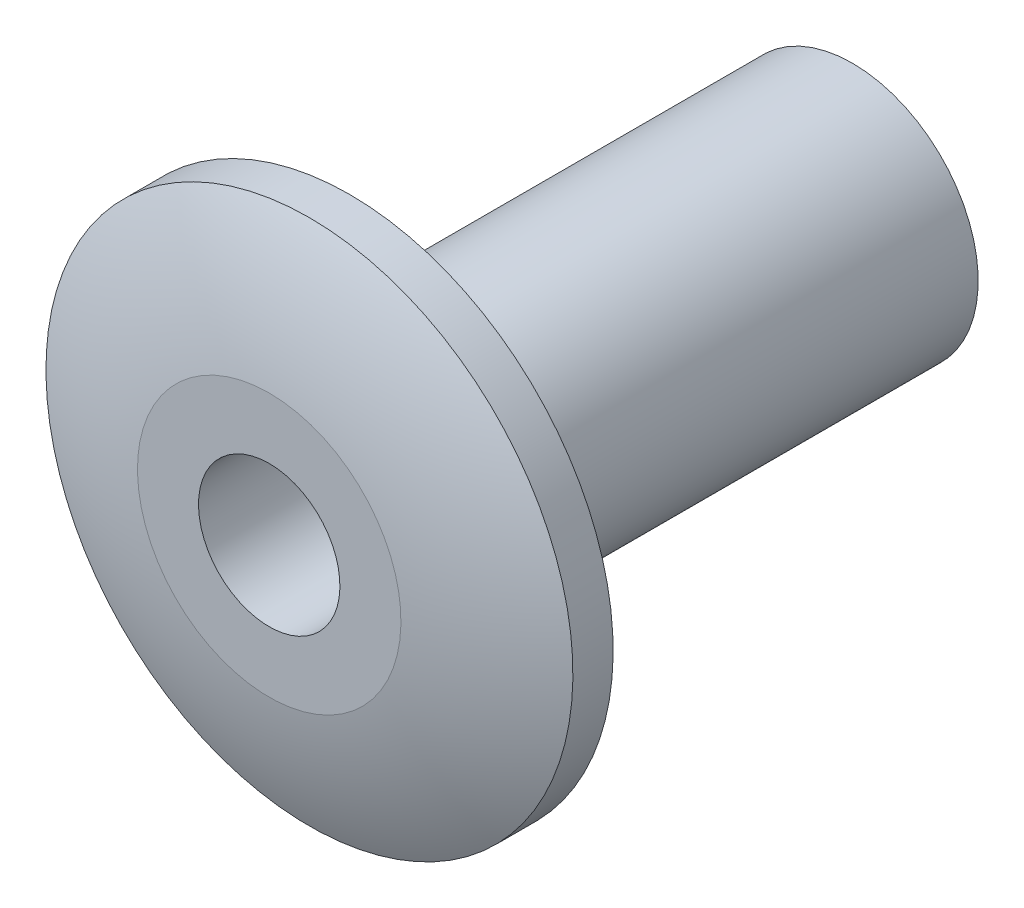
ISO-10303-21;
HEADER;
FILE_DESCRIPTION(('STEP AP214'),'2;1');
FILE_NAME('part.step','',(''),(''),'','','');
FILE_SCHEMA(('AUTOMOTIVE_DESIGN { 1 0 10303 214 1 1 1 1 }'));
ENDSEC;
DATA;
#1=APPLICATION_CONTEXT('core data for automotive mechanical design processes');
#2=APPLICATION_PROTOCOL_DEFINITION('international standard','automotive_design',2000,#1);
#3=PRODUCT_CONTEXT('',#1,'mechanical');
#4=PRODUCT('Part','Part','',(#3));
#5=PRODUCT_RELATED_PRODUCT_CATEGORY('part','',(#4));
#6=PRODUCT_DEFINITION_FORMATION('','',#4);
#7=PRODUCT_DEFINITION_CONTEXT('part definition',#1,'design');
#8=PRODUCT_DEFINITION('design','',#6,#7);
#9=PRODUCT_DEFINITION_SHAPE('','',#8);
#10=(LENGTH_UNIT() NAMED_UNIT(*) SI_UNIT(.MILLI.,.METRE.));
#11=(NAMED_UNIT(*) PLANE_ANGLE_UNIT() SI_UNIT($,.RADIAN.));
#12=(NAMED_UNIT(*) SI_UNIT($,.STERADIAN.) SOLID_ANGLE_UNIT());
#13=UNCERTAINTY_MEASURE_WITH_UNIT(LENGTH_MEASURE(1.E-05),#10,'distance_accuracy_value','');
#14=(GEOMETRIC_REPRESENTATION_CONTEXT(3) GLOBAL_UNCERTAINTY_ASSIGNED_CONTEXT((#13)) GLOBAL_UNIT_ASSIGNED_CONTEXT((#10,
#11,#12)) REPRESENTATION_CONTEXT('',''));
#15=CARTESIAN_POINT('',(0.,0.,0.));
#16=DIRECTION('',(0.,0.,1.));
#17=DIRECTION('',(1.,0.,0.));
#18=AXIS2_PLACEMENT_3D('',#15,#16,#17);
#19=CARTESIAN_POINT('',(0.,0.,-6.35));
#20=DIRECTION('',(0.,0.,-1.));
#21=DIRECTION('',(0.,1.,0.));
#22=AXIS2_PLACEMENT_3D('',#19,#20,#21);
#23=CYLINDRICAL_SURFACE('',#22,3.3274);
#24=CARTESIAN_POINT('',(0.,0.,0.507999999999998));
#25=DIRECTION('',(0.,0.,-1.));
#26=DIRECTION('',(0.,1.,0.));
#27=AXIS2_PLACEMENT_3D('',#24,#25,#26);
#28=CIRCLE('',#27,3.3274);
#29=CARTESIAN_POINT('',(0.,3.3274,0.507999999999998));
#30=VERTEX_POINT('',#29);
#31=EDGE_CURVE('E10',#30,#30,#28,.T.);
#32=ORIENTED_EDGE('',*,*,#31,.T.);
#33=EDGE_LOOP('',(#32));
#34=FACE_BOUND('',#33,.T.);
#35=CARTESIAN_POINT('',(0.,0.,0.));
#36=DIRECTION('',(0.,0.,-1.));
#37=DIRECTION('',(0.,1.,0.));
#38=AXIS2_PLACEMENT_3D('',#35,#36,#37);
#39=CIRCLE('',#38,3.3274);
#40=CARTESIAN_POINT('',(0.,3.3274,0.));
#41=VERTEX_POINT('',#40);
#42=EDGE_CURVE('E58',#41,#41,#39,.T.);
#43=ORIENTED_EDGE('',*,*,#42,.F.);
#44=EDGE_LOOP('',(#43));
#45=FACE_BOUND('',#44,.T.);
#46=ADVANCED_FACE('F33',(#34,#45),#23,.T.);
#47=CARTESIAN_POINT('',(0.,0.,-4.81139499999999));
#48=DIRECTION('',(0.,0.,-1.));
#49=DIRECTION('',(0.,1.,0.));
#50=AXIS2_PLACEMENT_3D('',#47,#48,#49);
#51=DEGENERATE_TOROIDAL_SURFACE('',#50,0.79375,5.89197297079042,.T.);
#52=CARTESIAN_POINT('',(0.,0.,1.016));
#53=DIRECTION('',(0.,0.,-1.));
#54=DIRECTION('',(0.,1.,0.));
#55=AXIS2_PLACEMENT_3D('',#52,#53,#54);
#56=CIRCLE('',#55,1.6637);
#57=CARTESIAN_POINT('',(0.,1.6637,1.016));
#58=VERTEX_POINT('',#57);
#59=EDGE_CURVE('E39',#58,#58,#56,.T.);
#60=ORIENTED_EDGE('',*,*,#59,.T.);
#61=EDGE_LOOP('',(#60));
#62=FACE_BOUND('',#61,.T.);
#63=ORIENTED_EDGE('',*,*,#31,.F.);
#64=EDGE_LOOP('',(#63));
#65=FACE_BOUND('',#64,.T.);
#66=ADVANCED_FACE('F66',(#62,#65),#51,.T.);
#67=CARTESIAN_POINT('',(0.,0.89296875,1.016));
#68=DIRECTION('',(0.,0.,1.));
#69=DIRECTION('',(0.,-1.,0.));
#70=AXIS2_PLACEMENT_3D('',#67,#68,#69);
#71=PLANE('',#70);
#72=CARTESIAN_POINT('',(0.,0.,1.016));
#73=DIRECTION('',(0.,0.,-1.));
#74=DIRECTION('',(0.,1.,0.));
#75=AXIS2_PLACEMENT_3D('',#72,#73,#74);
#76=CIRCLE('',#75,0.892968750000001);
#77=CARTESIAN_POINT('',(0.,0.89296875,1.016));
#78=VERTEX_POINT('',#77);
#79=EDGE_CURVE('E43',#78,#78,#76,.T.);
#80=ORIENTED_EDGE('',*,*,#79,.T.);
#81=EDGE_LOOP('',(#80));
#82=FACE_BOUND('',#81,.T.);
#83=ORIENTED_EDGE('',*,*,#59,.F.);
#84=EDGE_LOOP('',(#83));
#85=FACE_BOUND('',#84,.T.);
#86=ADVANCED_FACE('F70',(#82,#85),#71,.T.);
#87=CARTESIAN_POINT('',(0.,0.,-6.35));
#88=DIRECTION('',(0.,0.,-1.));
#89=DIRECTION('',(0.,1.,0.));
#90=AXIS2_PLACEMENT_3D('',#87,#88,#89);
#91=CYLINDRICAL_SURFACE('',#90,0.892968750000001);
#92=CARTESIAN_POINT('',(0.,0.,-0.635000000000002));
#93=DIRECTION('',(0.,0.,-1.));
#94=DIRECTION('',(0.,1.,0.));
#95=AXIS2_PLACEMENT_3D('',#92,#93,#94);
#96=CIRCLE('',#95,0.892968750000001);
#97=CARTESIAN_POINT('',(0.,0.89296875,-0.635000000000002));
#98=VERTEX_POINT('',#97);
#99=EDGE_CURVE('E47',#98,#98,#96,.T.);
#100=ORIENTED_EDGE('',*,*,#99,.T.);
#101=EDGE_LOOP('',(#100));
#102=FACE_BOUND('',#101,.T.);
#103=ORIENTED_EDGE('',*,*,#79,.F.);
#104=EDGE_LOOP('',(#103));
#105=FACE_BOUND('',#104,.T.);
#106=ADVANCED_FACE('F74',(#102,#105),#91,.F.);
#107=CARTESIAN_POINT('',(0.,0.89296875,-0.635000000000002));
#108=DIRECTION('',(0.,0.,1.));
#109=DIRECTION('',(0.,-1.,0.));
#110=AXIS2_PLACEMENT_3D('',#107,#108,#109);
#111=PLANE('',#110);
#112=ORIENTED_EDGE('',*,*,#99,.F.);
#113=EDGE_LOOP('',(#112));
#114=FACE_BOUND('',#113,.T.);
#115=ADVANCED_FACE('F81',(#114),#111,.T.);
#116=CARTESIAN_POINT('',(0.,1.5875,-6.35));
#117=DIRECTION('',(0.,0.,-1.));
#118=DIRECTION('',(0.,1.,0.));
#119=AXIS2_PLACEMENT_3D('',#116,#117,#118);
#120=PLANE('',#119);
#121=CARTESIAN_POINT('',(0.,0.,-6.35));
#122=DIRECTION('',(0.,0.,-1.));
#123=DIRECTION('',(0.,1.,0.));
#124=AXIS2_PLACEMENT_3D('',#121,#122,#123);
#125=CIRCLE('',#124,1.5875);
#126=CARTESIAN_POINT('',(0.,1.5875,-6.35));
#127=VERTEX_POINT('',#126);
#128=EDGE_CURVE('E52',#127,#127,#125,.T.);
#129=ORIENTED_EDGE('',*,*,#128,.T.);
#130=EDGE_LOOP('',(#129));
#131=FACE_BOUND('',#130,.T.);
#132=ADVANCED_FACE('F85',(#131),#120,.T.);
#133=CARTESIAN_POINT('',(0.,0.,-6.35));
#134=DIRECTION('',(0.,0.,-1.));
#135=DIRECTION('',(0.,1.,0.));
#136=AXIS2_PLACEMENT_3D('',#133,#134,#135);
#137=CYLINDRICAL_SURFACE('',#136,1.5875);
#138=CARTESIAN_POINT('',(0.,0.,0.));
#139=DIRECTION('',(0.,0.,-1.));
#140=DIRECTION('',(0.,1.,0.));
#141=AXIS2_PLACEMENT_3D('',#138,#139,#140);
#142=CIRCLE('',#141,1.5875);
#143=CARTESIAN_POINT('',(0.,1.5875,0.));
#144=VERTEX_POINT('',#143);
#145=EDGE_CURVE('E55',#144,#144,#142,.T.);
#146=ORIENTED_EDGE('',*,*,#145,.T.);
#147=EDGE_LOOP('',(#146));
#148=FACE_BOUND('',#147,.T.);
#149=ORIENTED_EDGE('',*,*,#128,.F.);
#150=EDGE_LOOP('',(#149));
#151=FACE_BOUND('',#150,.T.);
#152=ADVANCED_FACE('F89',(#148,#151),#137,.T.);
#153=CARTESIAN_POINT('',(0.,1.5875,0.));
#154=DIRECTION('',(0.,0.,-1.));
#155=DIRECTION('',(0.,1.,0.));
#156=AXIS2_PLACEMENT_3D('',#153,#154,#155);
#157=PLANE('',#156);
#158=ORIENTED_EDGE('',*,*,#42,.T.);
#159=EDGE_LOOP('',(#158));
#160=FACE_BOUND('',#159,.T.);
#161=ORIENTED_EDGE('',*,*,#145,.F.);
#162=EDGE_LOOP('',(#161));
#163=FACE_BOUND('',#162,.T.);
#164=ADVANCED_FACE('F62',(#160,#163),#157,.T.);
#165=CLOSED_SHELL('',(#46,#66,#86,#106,#115,#132,#152,#164));
#166=MANIFOLD_SOLID_BREP('B2',#165);
#167=ADVANCED_BREP_SHAPE_REPRESENTATION('',(#18,#166),#14);
#168=SHAPE_DEFINITION_REPRESENTATION(#9,#167);
ENDSEC;
END-ISO-10303-21;
